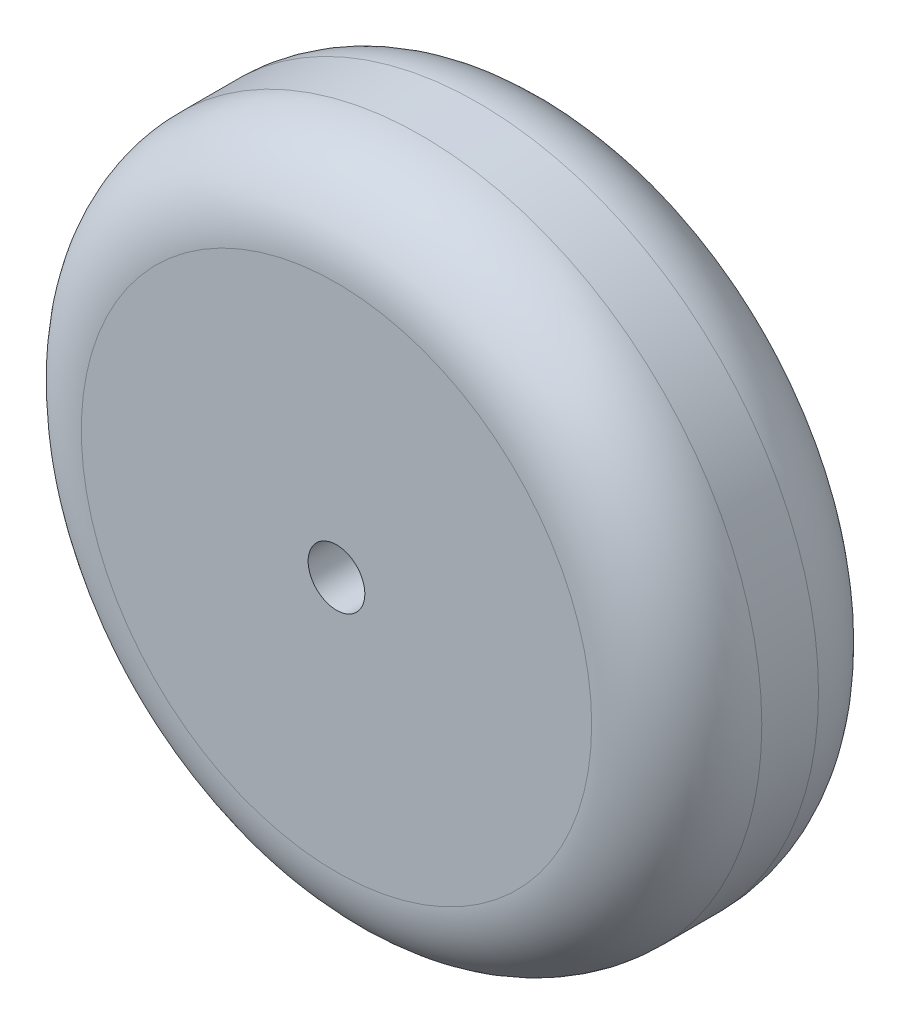
ISO-10303-21;
HEADER;
FILE_DESCRIPTION(('STEP AP214'),'2;1');
FILE_NAME('part.step','',(''),(''),'','','');
FILE_SCHEMA(('AUTOMOTIVE_DESIGN { 1 0 10303 214 1 1 1 1 }'));
ENDSEC;
DATA;
#1=APPLICATION_CONTEXT('core data for automotive mechanical design processes');
#2=APPLICATION_PROTOCOL_DEFINITION('international standard','automotive_design',2000,#1);
#3=PRODUCT_CONTEXT('',#1,'mechanical');
#4=PRODUCT('Part','Part','',(#3));
#5=PRODUCT_RELATED_PRODUCT_CATEGORY('part','',(#4));
#6=PRODUCT_DEFINITION_FORMATION('','',#4);
#7=PRODUCT_DEFINITION_CONTEXT('part definition',#1,'design');
#8=PRODUCT_DEFINITION('design','',#6,#7);
#9=PRODUCT_DEFINITION_SHAPE('','',#8);
#10=(LENGTH_UNIT() NAMED_UNIT(*) SI_UNIT(.MILLI.,.METRE.));
#11=(NAMED_UNIT(*) PLANE_ANGLE_UNIT() SI_UNIT($,.RADIAN.));
#12=(NAMED_UNIT(*) SI_UNIT($,.STERADIAN.) SOLID_ANGLE_UNIT());
#13=UNCERTAINTY_MEASURE_WITH_UNIT(LENGTH_MEASURE(1.E-05),#10,'distance_accuracy_value','');
#14=(GEOMETRIC_REPRESENTATION_CONTEXT(3) GLOBAL_UNCERTAINTY_ASSIGNED_CONTEXT((#13)) GLOBAL_UNIT_ASSIGNED_CONTEXT((#10,
#11,#12)) REPRESENTATION_CONTEXT('',''));
#15=CARTESIAN_POINT('',(0.,0.,0.));
#16=DIRECTION('',(0.,0.,1.));
#17=DIRECTION('',(1.,0.,0.));
#18=AXIS2_PLACEMENT_3D('',#15,#16,#17);
#19=CARTESIAN_POINT('',(0.,0.,-20.));
#20=DIRECTION('',(0.,0.,1.));
#21=DIRECTION('',(-1.,0.,0.));
#22=AXIS2_PLACEMENT_3D('',#19,#20,#21);
#23=CYLINDRICAL_SURFACE('',#22,30.);
#24=CARTESIAN_POINT('',(0.,0.,-12.5));
#25=DIRECTION('',(0.,0.,1.));
#26=DIRECTION('',(1.,0.,0.));
#27=AXIS2_PLACEMENT_3D('',#24,#25,#26);
#28=CIRCLE('',#27,30.);
#29=CARTESIAN_POINT('',(30.,0.,-12.5));
#30=VERTEX_POINT('',#29);
#31=EDGE_CURVE('E42',#30,#30,#28,.F.);
#32=ORIENTED_EDGE('',*,*,#31,.F.);
#33=EDGE_LOOP('',(#32));
#34=FACE_BOUND('',#33,.T.);
#35=CARTESIAN_POINT('',(0.,0.,-7.5));
#36=DIRECTION('',(0.,0.,1.));
#37=DIRECTION('',(1.,0.,0.));
#38=AXIS2_PLACEMENT_3D('',#35,#36,#37);
#39=CIRCLE('',#38,30.);
#40=CARTESIAN_POINT('',(30.,0.,-7.5));
#41=VERTEX_POINT('',#40);
#42=EDGE_CURVE('E46',#41,#41,#39,.T.);
#43=ORIENTED_EDGE('',*,*,#42,.F.);
#44=EDGE_LOOP('',(#43));
#45=FACE_BOUND('',#44,.T.);
#46=ADVANCED_FACE('F35',(#34,#45),#23,.T.);
#47=CARTESIAN_POINT('',(0.,0.,-20.));
#48=DIRECTION('',(0.,0.,-1.));
#49=DIRECTION('',(1.,0.,0.));
#50=AXIS2_PLACEMENT_3D('',#47,#48,#49);
#51=PLANE('',#50);
#52=CARTESIAN_POINT('',(0.,0.,-20.));
#53=DIRECTION('',(0.,0.,1.));
#54=DIRECTION('',(1.,0.,0.));
#55=AXIS2_PLACEMENT_3D('',#52,#53,#54);
#56=CIRCLE('',#55,22.5);
#57=CARTESIAN_POINT('',(22.5,0.,-20.));
#58=VERTEX_POINT('',#57);
#59=EDGE_CURVE('E50',#58,#58,#56,.T.);
#60=ORIENTED_EDGE('',*,*,#59,.F.);
#61=EDGE_LOOP('',(#60));
#62=FACE_BOUND('',#61,.T.);
#63=CARTESIAN_POINT('',(0.,0.,-20.));
#64=DIRECTION('',(0.,0.,1.));
#65=DIRECTION('',(1.,0.,0.));
#66=AXIS2_PLACEMENT_3D('',#63,#64,#65);
#67=CIRCLE('',#66,2.5);
#68=CARTESIAN_POINT('',(2.5,0.,-20.));
#69=VERTEX_POINT('',#68);
#70=EDGE_CURVE('E56',#69,#69,#67,.T.);
#71=ORIENTED_EDGE('',*,*,#70,.T.);
#72=EDGE_LOOP('',(#71));
#73=FACE_BOUND('',#72,.T.);
#74=ADVANCED_FACE('F67',(#62,#73),#51,.T.);
#75=CARTESIAN_POINT('',(0.,0.,0.));
#76=DIRECTION('',(0.,0.,-1.));
#77=DIRECTION('',(1.,0.,0.));
#78=AXIS2_PLACEMENT_3D('',#75,#76,#77);
#79=PLANE('',#78);
#80=CARTESIAN_POINT('',(0.,0.,0.));
#81=DIRECTION('',(0.,0.,1.));
#82=DIRECTION('',(1.,0.,0.));
#83=AXIS2_PLACEMENT_3D('',#80,#81,#82);
#84=CIRCLE('',#83,22.5);
#85=CARTESIAN_POINT('',(22.5,0.,0.));
#86=VERTEX_POINT('',#85);
#87=EDGE_CURVE('E10',#86,#86,#84,.F.);
#88=ORIENTED_EDGE('',*,*,#87,.F.);
#89=EDGE_LOOP('',(#88));
#90=FACE_BOUND('',#89,.T.);
#91=CARTESIAN_POINT('',(0.,0.,0.));
#92=DIRECTION('',(0.,0.,1.));
#93=DIRECTION('',(1.,0.,0.));
#94=AXIS2_PLACEMENT_3D('',#91,#92,#93);
#95=CIRCLE('',#94,2.5);
#96=CARTESIAN_POINT('',(2.5,0.,0.));
#97=VERTEX_POINT('',#96);
#98=EDGE_CURVE('E55',#97,#97,#95,.T.);
#99=ORIENTED_EDGE('',*,*,#98,.F.);
#100=EDGE_LOOP('',(#99));
#101=FACE_BOUND('',#100,.T.);
#102=ADVANCED_FACE('F65',(#90,#101),#79,.F.);
#103=CARTESIAN_POINT('',(0.,0.,0.));
#104=DIRECTION('',(0.,0.,-1.));
#105=DIRECTION('',(1.,0.,0.));
#106=AXIS2_PLACEMENT_3D('',#103,#104,#105);
#107=CYLINDRICAL_SURFACE('',#106,2.5);
#108=ORIENTED_EDGE('',*,*,#98,.T.);
#109=EDGE_LOOP('',(#108));
#110=FACE_BOUND('',#109,.T.);
#111=ORIENTED_EDGE('',*,*,#70,.F.);
#112=EDGE_LOOP('',(#111));
#113=FACE_BOUND('',#112,.T.);
#114=ADVANCED_FACE('F62',(#110,#113),#107,.F.);
#115=CARTESIAN_POINT('',(0.,0.,-12.5));
#116=DIRECTION('',(0.,0.,-1.));
#117=DIRECTION('',(1.,0.,0.));
#118=AXIS2_PLACEMENT_3D('',#115,#116,#117);
#119=TOROIDAL_SURFACE('',#118,22.5,7.5);
#120=ORIENTED_EDGE('',*,*,#31,.T.);
#121=EDGE_LOOP('',(#120));
#122=FACE_BOUND('',#121,.T.);
#123=ORIENTED_EDGE('',*,*,#59,.T.);
#124=EDGE_LOOP('',(#123));
#125=FACE_BOUND('',#124,.T.);
#126=ADVANCED_FACE('F74',(#122,#125),#119,.T.);
#127=CARTESIAN_POINT('',(0.,0.,-7.5));
#128=DIRECTION('',(0.,0.,-1.));
#129=DIRECTION('',(1.,0.,0.));
#130=AXIS2_PLACEMENT_3D('',#127,#128,#129);
#131=TOROIDAL_SURFACE('',#130,22.5,7.5);
#132=ORIENTED_EDGE('',*,*,#87,.T.);
#133=EDGE_LOOP('',(#132));
#134=FACE_BOUND('',#133,.T.);
#135=ORIENTED_EDGE('',*,*,#42,.T.);
#136=EDGE_LOOP('',(#135));
#137=FACE_BOUND('',#136,.T.);
#138=ADVANCED_FACE('F37',(#134,#137),#131,.T.);
#139=CLOSED_SHELL('',(#46,#74,#102,#114,#126,#138));
#140=MANIFOLD_SOLID_BREP('B2',#139);
#141=ADVANCED_BREP_SHAPE_REPRESENTATION('',(#18,#140),#14);
#142=SHAPE_DEFINITION_REPRESENTATION(#9,#141);
ENDSEC;
END-ISO-10303-21;
